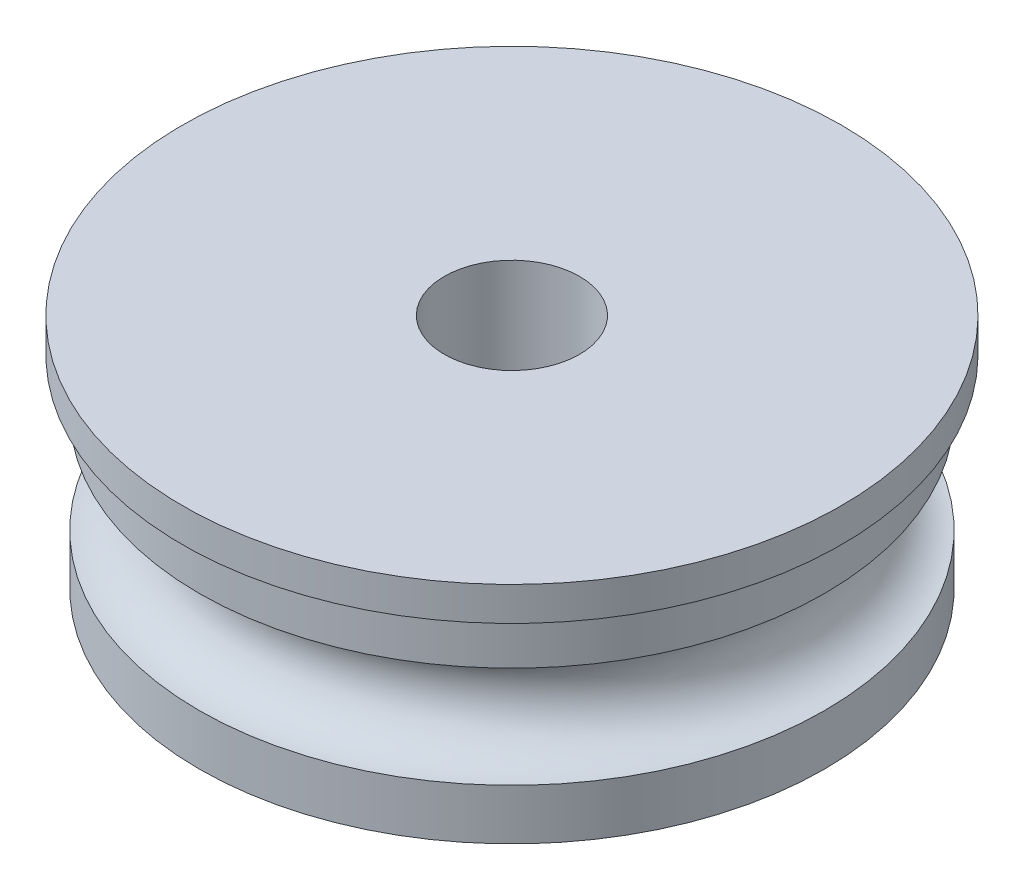
ISO-10303-21;
HEADER;
FILE_DESCRIPTION(('STEP AP214'),'2;1');
FILE_NAME('part.step','',(''),(''),'','','');
FILE_SCHEMA(('AUTOMOTIVE_DESIGN { 1 0 10303 214 1 1 1 1 }'));
ENDSEC;
DATA;
#1=APPLICATION_CONTEXT('core data for automotive mechanical design processes');
#2=APPLICATION_PROTOCOL_DEFINITION('international standard','automotive_design',2000,#1);
#3=PRODUCT_CONTEXT('',#1,'mechanical');
#4=PRODUCT('Part','Part','',(#3));
#5=PRODUCT_RELATED_PRODUCT_CATEGORY('part','',(#4));
#6=PRODUCT_DEFINITION_FORMATION('','',#4);
#7=PRODUCT_DEFINITION_CONTEXT('part definition',#1,'design');
#8=PRODUCT_DEFINITION('design','',#6,#7);
#9=PRODUCT_DEFINITION_SHAPE('','',#8);
#10=(LENGTH_UNIT() NAMED_UNIT(*) SI_UNIT(.MILLI.,.METRE.));
#11=(NAMED_UNIT(*) PLANE_ANGLE_UNIT() SI_UNIT($,.RADIAN.));
#12=(NAMED_UNIT(*) SI_UNIT($,.STERADIAN.) SOLID_ANGLE_UNIT());
#13=UNCERTAINTY_MEASURE_WITH_UNIT(LENGTH_MEASURE(1.E-05),#10,'distance_accuracy_value','');
#14=(GEOMETRIC_REPRESENTATION_CONTEXT(3) GLOBAL_UNCERTAINTY_ASSIGNED_CONTEXT((#13)) GLOBAL_UNIT_ASSIGNED_CONTEXT((#10,
#11,#12)) REPRESENTATION_CONTEXT('',''));
#15=CARTESIAN_POINT('',(0.,0.,0.));
#16=DIRECTION('',(0.,0.,1.));
#17=DIRECTION('',(1.,0.,0.));
#18=AXIS2_PLACEMENT_3D('',#15,#16,#17);
#19=CARTESIAN_POINT('',(6.,1.69387755102041,0.));
#20=DIRECTION('',(0.,-1.,0.));
#21=DIRECTION('',(0.,0.,-1.));
#22=AXIS2_PLACEMENT_3D('',#19,#20,#21);
#23=PLANE('',#22);
#24=CARTESIAN_POINT('',(0.,1.69387755102041,0.));
#25=DIRECTION('',(0.,-1.,0.));
#26=DIRECTION('',(0.,0.,-1.));
#27=AXIS2_PLACEMENT_3D('',#24,#25,#26);
#28=CIRCLE('',#27,6.);
#29=CARTESIAN_POINT('',(0.,1.69387755102041,-6.));
#30=VERTEX_POINT('',#29);
#31=EDGE_CURVE('E10',#30,#30,#28,.T.);
#32=ORIENTED_EDGE('',*,*,#31,.T.);
#33=EDGE_LOOP('',(#32));
#34=FACE_BOUND('',#33,.T.);
#35=CARTESIAN_POINT('',(0.,1.69387755102041,0.));
#36=DIRECTION('',(0.,-1.,0.));
#37=DIRECTION('',(0.,0.,-1.));
#38=AXIS2_PLACEMENT_3D('',#35,#36,#37);
#39=CIRCLE('',#38,2.);
#40=CARTESIAN_POINT('',(0.,1.69387755102041,-2.));
#41=VERTEX_POINT('',#40);
#42=EDGE_CURVE('E65',#41,#41,#39,.T.);
#43=ORIENTED_EDGE('',*,*,#42,.F.);
#44=EDGE_LOOP('',(#43));
#45=FACE_BOUND('',#44,.T.);
#46=ADVANCED_FACE('F31',(#34,#45),#23,.T.);
#47=CARTESIAN_POINT('',(0.,-8.63265306122449,0.));
#48=DIRECTION('',(0.,-1.,0.));
#49=DIRECTION('',(0.,0.,-1.));
#50=AXIS2_PLACEMENT_3D('',#47,#48,#49);
#51=CYLINDRICAL_SURFACE('',#50,6.);
#52=CARTESIAN_POINT('',(0.,-1.30612244897959,0.));
#53=DIRECTION('',(0.,-1.,0.));
#54=DIRECTION('',(0.,0.,-1.));
#55=AXIS2_PLACEMENT_3D('',#52,#53,#54);
#56=CIRCLE('',#55,6.);
#57=CARTESIAN_POINT('',(0.,-1.30612244897959,-6.));
#58=VERTEX_POINT('',#57);
#59=EDGE_CURVE('E37',#58,#58,#56,.T.);
#60=ORIENTED_EDGE('',*,*,#59,.T.);
#61=EDGE_LOOP('',(#60));
#62=FACE_BOUND('',#61,.T.);
#63=ORIENTED_EDGE('',*,*,#31,.F.);
#64=EDGE_LOOP('',(#63));
#65=FACE_BOUND('',#64,.T.);
#66=ADVANCED_FACE('F73',(#62,#65),#51,.F.);
#67=CARTESIAN_POINT('',(9.25,-1.30612244897959,0.));
#68=DIRECTION('',(0.,-1.,0.));
#69=DIRECTION('',(0.,0.,-1.));
#70=AXIS2_PLACEMENT_3D('',#67,#68,#69);
#71=PLANE('',#70);
#72=CARTESIAN_POINT('',(0.,-1.30612244897959,0.));
#73=DIRECTION('',(0.,-1.,0.));
#74=DIRECTION('',(0.,0.,-1.));
#75=AXIS2_PLACEMENT_3D('',#72,#73,#74);
#76=CIRCLE('',#75,9.25);
#77=CARTESIAN_POINT('',(0.,-1.30612244897959,-9.25));
#78=VERTEX_POINT('',#77);
#79=EDGE_CURVE('E41',#78,#78,#76,.T.);
#80=ORIENTED_EDGE('',*,*,#79,.T.);
#81=EDGE_LOOP('',(#80));
#82=FACE_BOUND('',#81,.T.);
#83=ORIENTED_EDGE('',*,*,#59,.F.);
#84=EDGE_LOOP('',(#83));
#85=FACE_BOUND('',#84,.T.);
#86=ADVANCED_FACE('F77',(#82,#85),#71,.T.);
#87=CARTESIAN_POINT('',(0.,-8.63265306122449,0.));
#88=DIRECTION('',(0.,-1.,0.));
#89=DIRECTION('',(0.,0.,-1.));
#90=AXIS2_PLACEMENT_3D('',#87,#88,#89);
#91=CYLINDRICAL_SURFACE('',#90,9.25);
#92=CARTESIAN_POINT('',(0.,0.19387755102041,0.));
#93=DIRECTION('',(0.,-1.,0.));
#94=DIRECTION('',(0.,0.,-1.));
#95=AXIS2_PLACEMENT_3D('',#92,#93,#94);
#96=CIRCLE('',#95,9.25);
#97=CARTESIAN_POINT('',(0.,0.19387755102041,-9.25));
#98=VERTEX_POINT('',#97);
#99=EDGE_CURVE('E45',#98,#98,#96,.T.);
#100=ORIENTED_EDGE('',*,*,#99,.T.);
#101=EDGE_LOOP('',(#100));
#102=FACE_BOUND('',#101,.T.);
#103=ORIENTED_EDGE('',*,*,#79,.F.);
#104=EDGE_LOOP('',(#103));
#105=FACE_BOUND('',#104,.T.);
#106=ADVANCED_FACE('F81',(#102,#105),#91,.T.);
#107=CARTESIAN_POINT('',(0.,1.69387755102041,0.));
#108=DIRECTION('',(0.,-1.,0.));
#109=DIRECTION('',(0.,0.,-1.));
#110=AXIS2_PLACEMENT_3D('',#107,#108,#109);
#111=TOROIDAL_SURFACE('',#110,9.25,1.5);
#112=CARTESIAN_POINT('',(0.,3.19387755102041,0.));
#113=DIRECTION('',(0.,-1.,0.));
#114=DIRECTION('',(0.,0.,-1.));
#115=AXIS2_PLACEMENT_3D('',#112,#113,#114);
#116=CIRCLE('',#115,9.25);
#117=CARTESIAN_POINT('',(0.,3.19387755102041,-9.25));
#118=VERTEX_POINT('',#117);
#119=EDGE_CURVE('E50',#118,#118,#116,.T.);
#120=ORIENTED_EDGE('',*,*,#119,.T.);
#121=EDGE_LOOP('',(#120));
#122=FACE_BOUND('',#121,.T.);
#123=ORIENTED_EDGE('',*,*,#99,.F.);
#124=EDGE_LOOP('',(#123));
#125=FACE_BOUND('',#124,.T.);
#126=ADVANCED_FACE('F88',(#122,#125),#111,.F.);
#127=CARTESIAN_POINT('',(0.,-8.63265306122449,0.));
#128=DIRECTION('',(0.,-1.,0.));
#129=DIRECTION('',(0.,0.,-1.));
#130=AXIS2_PLACEMENT_3D('',#127,#128,#129);
#131=CYLINDRICAL_SURFACE('',#130,9.25);
#132=CARTESIAN_POINT('',(0.,4.69387755102041,0.));
#133=DIRECTION('',(0.,-1.,0.));
#134=DIRECTION('',(0.,0.,-1.));
#135=AXIS2_PLACEMENT_3D('',#132,#133,#134);
#136=CIRCLE('',#135,9.25);
#137=CARTESIAN_POINT('',(0.,4.69387755102041,-9.25));
#138=VERTEX_POINT('',#137);
#139=EDGE_CURVE('E53',#138,#138,#136,.T.);
#140=ORIENTED_EDGE('',*,*,#139,.T.);
#141=EDGE_LOOP('',(#140));
#142=FACE_BOUND('',#141,.T.);
#143=ORIENTED_EDGE('',*,*,#119,.F.);
#144=EDGE_LOOP('',(#143));
#145=FACE_BOUND('',#144,.T.);
#146=ADVANCED_FACE('F92',(#142,#145),#131,.T.);
#147=CARTESIAN_POINT('',(9.75,4.69387755102041,0.));
#148=DIRECTION('',(0.,-1.,0.));
#149=DIRECTION('',(0.,0.,-1.));
#150=AXIS2_PLACEMENT_3D('',#147,#148,#149);
#151=PLANE('',#150);
#152=CARTESIAN_POINT('',(0.,4.69387755102041,0.));
#153=DIRECTION('',(0.,-1.,0.));
#154=DIRECTION('',(0.,0.,-1.));
#155=AXIS2_PLACEMENT_3D('',#152,#153,#154);
#156=CIRCLE('',#155,9.75);
#157=CARTESIAN_POINT('',(0.,4.69387755102041,-9.75));
#158=VERTEX_POINT('',#157);
#159=EDGE_CURVE('E56',#158,#158,#156,.T.);
#160=ORIENTED_EDGE('',*,*,#159,.T.);
#161=EDGE_LOOP('',(#160));
#162=FACE_BOUND('',#161,.T.);
#163=ORIENTED_EDGE('',*,*,#139,.F.);
#164=EDGE_LOOP('',(#163));
#165=FACE_BOUND('',#164,.T.);
#166=ADVANCED_FACE('F96',(#162,#165),#151,.T.);
#167=CARTESIAN_POINT('',(0.,-8.63265306122449,0.));
#168=DIRECTION('',(0.,-1.,0.));
#169=DIRECTION('',(0.,0.,-1.));
#170=AXIS2_PLACEMENT_3D('',#167,#168,#169);
#171=CYLINDRICAL_SURFACE('',#170,9.75);
#172=CARTESIAN_POINT('',(0.,5.69387755102041,0.));
#173=DIRECTION('',(0.,-1.,0.));
#174=DIRECTION('',(0.,0.,-1.));
#175=AXIS2_PLACEMENT_3D('',#172,#173,#174);
#176=CIRCLE('',#175,9.75);
#177=CARTESIAN_POINT('',(0.,5.69387755102041,-9.75));
#178=VERTEX_POINT('',#177);
#179=EDGE_CURVE('E59',#178,#178,#176,.T.);
#180=ORIENTED_EDGE('',*,*,#179,.T.);
#181=EDGE_LOOP('',(#180));
#182=FACE_BOUND('',#181,.T.);
#183=ORIENTED_EDGE('',*,*,#159,.F.);
#184=EDGE_LOOP('',(#183));
#185=FACE_BOUND('',#184,.T.);
#186=ADVANCED_FACE('F100',(#182,#185),#171,.T.);
#187=CARTESIAN_POINT('',(2.,5.69387755102041,0.));
#188=DIRECTION('',(0.,1.,0.));
#189=DIRECTION('',(0.,0.,1.));
#190=AXIS2_PLACEMENT_3D('',#187,#188,#189);
#191=PLANE('',#190);
#192=CARTESIAN_POINT('',(0.,5.69387755102041,0.));
#193=DIRECTION('',(0.,-1.,0.));
#194=DIRECTION('',(0.,0.,-1.));
#195=AXIS2_PLACEMENT_3D('',#192,#193,#194);
#196=CIRCLE('',#195,2.);
#197=CARTESIAN_POINT('',(0.,5.69387755102041,-2.));
#198=VERTEX_POINT('',#197);
#199=EDGE_CURVE('E62',#198,#198,#196,.T.);
#200=ORIENTED_EDGE('',*,*,#199,.T.);
#201=EDGE_LOOP('',(#200));
#202=FACE_BOUND('',#201,.T.);
#203=ORIENTED_EDGE('',*,*,#179,.F.);
#204=EDGE_LOOP('',(#203));
#205=FACE_BOUND('',#204,.T.);
#206=ADVANCED_FACE('F104',(#202,#205),#191,.T.);
#207=CARTESIAN_POINT('',(0.,-8.63265306122449,0.));
#208=DIRECTION('',(0.,-1.,0.));
#209=DIRECTION('',(0.,0.,-1.));
#210=AXIS2_PLACEMENT_3D('',#207,#208,#209);
#211=CYLINDRICAL_SURFACE('',#210,2.);
#212=ORIENTED_EDGE('',*,*,#42,.T.);
#213=EDGE_LOOP('',(#212));
#214=FACE_BOUND('',#213,.T.);
#215=ORIENTED_EDGE('',*,*,#199,.F.);
#216=EDGE_LOOP('',(#215));
#217=FACE_BOUND('',#216,.T.);
#218=ADVANCED_FACE('F69',(#214,#217),#211,.F.);
#219=CLOSED_SHELL('',(#46,#66,#86,#106,#126,#146,#166,#186,#206,#218));
#220=MANIFOLD_SOLID_BREP('B2',#219);
#221=ADVANCED_BREP_SHAPE_REPRESENTATION('',(#18,#220),#14);
#222=SHAPE_DEFINITION_REPRESENTATION(#9,#221);
ENDSEC;
END-ISO-10303-21;
